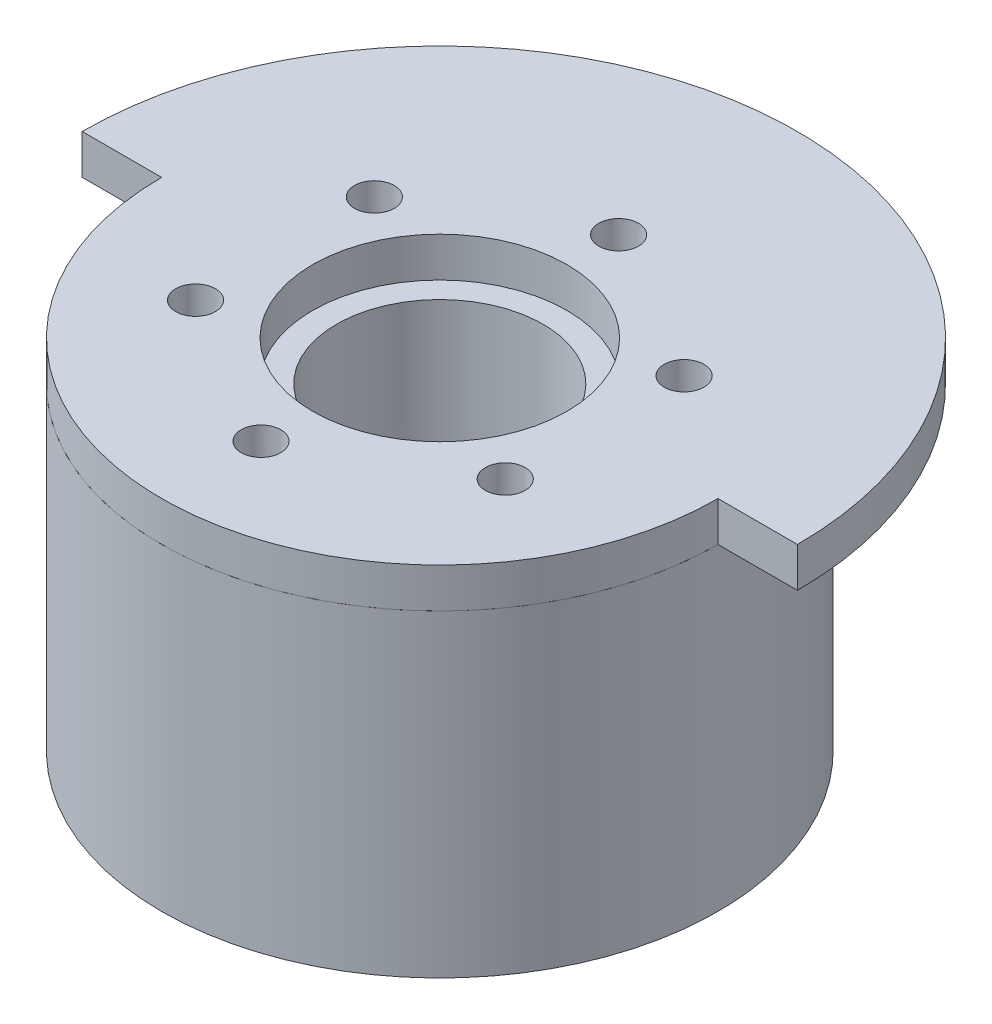
ISO-10303-21;
HEADER;
FILE_DESCRIPTION(('STEP AP214'),'2;1');
FILE_NAME('part.step','',(''),(''),'','','');
FILE_SCHEMA(('AUTOMOTIVE_DESIGN { 1 0 10303 214 1 1 1 1 }'));
ENDSEC;
DATA;
#1=APPLICATION_CONTEXT('core data for automotive mechanical design processes');
#2=APPLICATION_PROTOCOL_DEFINITION('international standard','automotive_design',2000,#1);
#3=PRODUCT_CONTEXT('',#1,'mechanical');
#4=PRODUCT('Part','Part','',(#3));
#5=PRODUCT_RELATED_PRODUCT_CATEGORY('part','',(#4));
#6=PRODUCT_DEFINITION_FORMATION('','',#4);
#7=PRODUCT_DEFINITION_CONTEXT('part definition',#1,'design');
#8=PRODUCT_DEFINITION('design','',#6,#7);
#9=PRODUCT_DEFINITION_SHAPE('','',#8);
#10=(LENGTH_UNIT() NAMED_UNIT(*) SI_UNIT(.MILLI.,.METRE.));
#11=(NAMED_UNIT(*) PLANE_ANGLE_UNIT() SI_UNIT($,.RADIAN.));
#12=(NAMED_UNIT(*) SI_UNIT($,.STERADIAN.) SOLID_ANGLE_UNIT());
#13=UNCERTAINTY_MEASURE_WITH_UNIT(LENGTH_MEASURE(1.E-05),#10,'distance_accuracy_value','');
#14=(GEOMETRIC_REPRESENTATION_CONTEXT(3) GLOBAL_UNCERTAINTY_ASSIGNED_CONTEXT((#13)) GLOBAL_UNIT_ASSIGNED_CONTEXT((#10,
#11,#12)) REPRESENTATION_CONTEXT('',''));
#15=CARTESIAN_POINT('',(0.,0.,0.));
#16=DIRECTION('',(0.,0.,1.));
#17=DIRECTION('',(1.,0.,0.));
#18=AXIS2_PLACEMENT_3D('',#15,#16,#17);
#19=CARTESIAN_POINT('',(0.,45.,0.));
#20=DIRECTION('',(0.,0.,-1.));
#21=DIRECTION('',(-1.,0.,0.));
#22=AXIS2_PLACEMENT_3D('',#19,#20,#21);
#23=PLANE('',#22);
#24=DIRECTION('',(1.,0.,0.));
#25=VECTOR('',#24,1.);
#26=CARTESIAN_POINT('',(0.,40.,0.));
#27=LINE('',#26,#25);
#28=CARTESIAN_POINT('',(35.,40.,0.));
#29=VERTEX_POINT('',#28);
#30=CARTESIAN_POINT('',(45.,40.,0.));
#31=VERTEX_POINT('',#30);
#32=EDGE_CURVE('E129',#29,#31,#27,.T.);
#33=ORIENTED_EDGE('',*,*,#32,.T.);
#34=DIRECTION('',(0.,-1.,0.));
#35=VECTOR('',#34,1.);
#36=CARTESIAN_POINT('',(45.,45.,0.));
#37=LINE('',#36,#35);
#38=CARTESIAN_POINT('',(45.,45.,0.));
#39=VERTEX_POINT('',#38);
#40=EDGE_CURVE('E12',#39,#31,#37,.T.);
#41=ORIENTED_EDGE('',*,*,#40,.F.);
#42=DIRECTION('',(1.,0.,0.));
#43=VECTOR('',#42,1.);
#44=CARTESIAN_POINT('',(0.,45.,0.));
#45=LINE('',#44,#43);
#46=CARTESIAN_POINT('',(35.,45.,0.));
#47=VERTEX_POINT('',#46);
#48=EDGE_CURVE('E99',#47,#39,#45,.T.);
#49=ORIENTED_EDGE('',*,*,#48,.F.);
#50=DIRECTION('',(0.,-1.,0.));
#51=VECTOR('',#50,1.);
#52=CARTESIAN_POINT('',(35.,45.,0.));
#53=LINE('',#52,#51);
#54=EDGE_CURVE('E128',#47,#29,#53,.T.);
#55=ORIENTED_EDGE('',*,*,#54,.T.);
#56=EDGE_LOOP('',(#33,#41,#49,#55));
#57=FACE_BOUND('',#56,.T.);
#58=ADVANCED_FACE('F47',(#57),#23,.F.);
#59=CARTESIAN_POINT('',(0.,45.,0.));
#60=DIRECTION('',(0.,-1.,0.));
#61=DIRECTION('',(0.,0.,-1.));
#62=AXIS2_PLACEMENT_3D('',#59,#60,#61);
#63=CYLINDRICAL_SURFACE('',#62,45.);
#64=CARTESIAN_POINT('',(0.,40.,0.));
#65=DIRECTION('',(0.,1.,0.));
#66=DIRECTION('',(0.,0.,1.));
#67=AXIS2_PLACEMENT_3D('',#64,#65,#66);
#68=CIRCLE('',#67,45.);
#69=CARTESIAN_POINT('',(-45.,40.,0.));
#70=VERTEX_POINT('',#69);
#71=EDGE_CURVE('E103',#31,#70,#68,.T.);
#72=ORIENTED_EDGE('',*,*,#71,.T.);
#73=DIRECTION('',(0.,-1.,0.));
#74=VECTOR('',#73,1.);
#75=CARTESIAN_POINT('',(-45.,45.,0.));
#76=LINE('',#75,#74);
#77=CARTESIAN_POINT('',(-45.,45.,0.));
#78=VERTEX_POINT('',#77);
#79=EDGE_CURVE('E55',#78,#70,#76,.T.);
#80=ORIENTED_EDGE('',*,*,#79,.F.);
#81=CARTESIAN_POINT('',(0.,45.,0.));
#82=DIRECTION('',(0.,1.,0.));
#83=DIRECTION('',(0.,0.,1.));
#84=AXIS2_PLACEMENT_3D('',#81,#82,#83);
#85=CIRCLE('',#84,45.);
#86=EDGE_CURVE('E93',#39,#78,#85,.T.);
#87=ORIENTED_EDGE('',*,*,#86,.F.);
#88=ORIENTED_EDGE('',*,*,#40,.T.);
#89=EDGE_LOOP('',(#72,#80,#87,#88));
#90=FACE_BOUND('',#89,.T.);
#91=ADVANCED_FACE('F102',(#90),#63,.T.);
#92=CARTESIAN_POINT('',(0.,45.,0.));
#93=DIRECTION('',(0.,0.,-1.));
#94=DIRECTION('',(-1.,0.,0.));
#95=AXIS2_PLACEMENT_3D('',#92,#93,#94);
#96=PLANE('',#95);
#97=DIRECTION('',(1.,0.,0.));
#98=VECTOR('',#97,1.);
#99=CARTESIAN_POINT('',(0.,40.,0.));
#100=LINE('',#99,#98);
#101=CARTESIAN_POINT('',(-35.,40.,0.));
#102=VERTEX_POINT('',#101);
#103=EDGE_CURVE('E80',#70,#102,#100,.T.);
#104=ORIENTED_EDGE('',*,*,#103,.T.);
#105=DIRECTION('',(0.,-1.,0.));
#106=VECTOR('',#105,1.);
#107=CARTESIAN_POINT('',(-35.,45.,0.));
#108=LINE('',#107,#106);
#109=CARTESIAN_POINT('',(-35.,45.,0.));
#110=VERTEX_POINT('',#109);
#111=EDGE_CURVE('E104',#110,#102,#108,.T.);
#112=ORIENTED_EDGE('',*,*,#111,.F.);
#113=DIRECTION('',(1.,0.,0.));
#114=VECTOR('',#113,1.);
#115=CARTESIAN_POINT('',(0.,45.,0.));
#116=LINE('',#115,#114);
#117=EDGE_CURVE('E97',#78,#110,#116,.T.);
#118=ORIENTED_EDGE('',*,*,#117,.F.);
#119=ORIENTED_EDGE('',*,*,#79,.T.);
#120=EDGE_LOOP('',(#104,#112,#118,#119));
#121=FACE_BOUND('',#120,.T.);
#122=ADVANCED_FACE('F105',(#121),#96,.F.);
#123=CARTESIAN_POINT('',(19.4855715851499,45.,11.25));
#124=DIRECTION('',(0.,-1.,0.));
#125=DIRECTION('',(0.,0.,-1.));
#126=AXIS2_PLACEMENT_3D('',#123,#124,#125);
#127=CYLINDRICAL_SURFACE('',#126,2.5);
#128=CARTESIAN_POINT('',(19.4855715851499,45.,11.25));
#129=DIRECTION('',(0.,1.,0.));
#130=DIRECTION('',(0.,0.,1.));
#131=AXIS2_PLACEMENT_3D('',#128,#129,#130);
#132=CIRCLE('',#131,2.5);
#133=CARTESIAN_POINT('',(19.4855715851499,45.,13.75));
#134=VERTEX_POINT('',#133);
#135=EDGE_CURVE('E125',#134,#134,#132,.F.);
#136=ORIENTED_EDGE('',*,*,#135,.F.);
#137=EDGE_LOOP('',(#136));
#138=FACE_BOUND('',#137,.T.);
#139=CARTESIAN_POINT('',(19.4855715851499,40.,11.25));
#140=DIRECTION('',(0.,1.,0.));
#141=DIRECTION('',(0.,0.,1.));
#142=AXIS2_PLACEMENT_3D('',#139,#140,#141);
#143=CIRCLE('',#142,2.5);
#144=CARTESIAN_POINT('',(19.4855715851499,40.,13.75));
#145=VERTEX_POINT('',#144);
#146=EDGE_CURVE('E151',#145,#145,#143,.F.);
#147=ORIENTED_EDGE('',*,*,#146,.T.);
#148=EDGE_LOOP('',(#147));
#149=FACE_BOUND('',#148,.T.);
#150=ADVANCED_FACE('F191',(#138,#149),#127,.F.);
#151=CARTESIAN_POINT('',(0.,45.,22.5));
#152=DIRECTION('',(0.,-1.,0.));
#153=DIRECTION('',(0.,0.,-1.));
#154=AXIS2_PLACEMENT_3D('',#151,#152,#153);
#155=CYLINDRICAL_SURFACE('',#154,2.5);
#156=CARTESIAN_POINT('',(0.,45.,22.5));
#157=DIRECTION('',(0.,1.,0.));
#158=DIRECTION('',(0.,0.,1.));
#159=AXIS2_PLACEMENT_3D('',#156,#157,#158);
#160=CIRCLE('',#159,2.5);
#161=CARTESIAN_POINT('',(0.,45.,25.));
#162=VERTEX_POINT('',#161);
#163=EDGE_CURVE('E122',#162,#162,#160,.F.);
#164=ORIENTED_EDGE('',*,*,#163,.F.);
#165=EDGE_LOOP('',(#164));
#166=FACE_BOUND('',#165,.T.);
#167=CARTESIAN_POINT('',(0.,40.,22.5));
#168=DIRECTION('',(0.,1.,0.));
#169=DIRECTION('',(0.,0.,1.));
#170=AXIS2_PLACEMENT_3D('',#167,#168,#169);
#171=CIRCLE('',#170,2.5);
#172=CARTESIAN_POINT('',(0.,40.,25.));
#173=VERTEX_POINT('',#172);
#174=EDGE_CURVE('E148',#173,#173,#171,.F.);
#175=ORIENTED_EDGE('',*,*,#174,.T.);
#176=EDGE_LOOP('',(#175));
#177=FACE_BOUND('',#176,.T.);
#178=ADVANCED_FACE('F208',(#166,#177),#155,.F.);
#179=CARTESIAN_POINT('',(-19.4855715851499,45.,-11.25));
#180=DIRECTION('',(0.,-1.,0.));
#181=DIRECTION('',(0.,0.,-1.));
#182=AXIS2_PLACEMENT_3D('',#179,#180,#181);
#183=CYLINDRICAL_SURFACE('',#182,2.5);
#184=CARTESIAN_POINT('',(-19.4855715851499,45.,-11.25));
#185=DIRECTION('',(0.,1.,0.));
#186=DIRECTION('',(0.,0.,1.));
#187=AXIS2_PLACEMENT_3D('',#184,#185,#186);
#188=CIRCLE('',#187,2.5);
#189=CARTESIAN_POINT('',(-19.4855715851499,45.,-8.74999999999999));
#190=VERTEX_POINT('',#189);
#191=EDGE_CURVE('E119',#190,#190,#188,.F.);
#192=ORIENTED_EDGE('',*,*,#191,.F.);
#193=EDGE_LOOP('',(#192));
#194=FACE_BOUND('',#193,.T.);
#195=CARTESIAN_POINT('',(-19.4855715851499,40.,-11.25));
#196=DIRECTION('',(0.,1.,0.));
#197=DIRECTION('',(0.,0.,1.));
#198=AXIS2_PLACEMENT_3D('',#195,#196,#197);
#199=CIRCLE('',#198,2.5);
#200=CARTESIAN_POINT('',(-19.4855715851499,40.,-8.74999999999999));
#201=VERTEX_POINT('',#200);
#202=EDGE_CURVE('E145',#201,#201,#199,.F.);
#203=ORIENTED_EDGE('',*,*,#202,.T.);
#204=EDGE_LOOP('',(#203));
#205=FACE_BOUND('',#204,.T.);
#206=ADVANCED_FACE('F204',(#194,#205),#183,.F.);
#207=CARTESIAN_POINT('',(19.4855715851499,45.,-11.25));
#208=DIRECTION('',(0.,-1.,0.));
#209=DIRECTION('',(0.,0.,-1.));
#210=AXIS2_PLACEMENT_3D('',#207,#208,#209);
#211=CYLINDRICAL_SURFACE('',#210,2.5);
#212=CARTESIAN_POINT('',(19.4855715851499,45.,-11.25));
#213=DIRECTION('',(0.,1.,0.));
#214=DIRECTION('',(0.,0.,1.));
#215=AXIS2_PLACEMENT_3D('',#212,#213,#214);
#216=CIRCLE('',#215,2.5);
#217=CARTESIAN_POINT('',(19.4855715851499,45.,-8.75000000000001));
#218=VERTEX_POINT('',#217);
#219=EDGE_CURVE('E116',#218,#218,#216,.F.);
#220=ORIENTED_EDGE('',*,*,#219,.F.);
#221=EDGE_LOOP('',(#220));
#222=FACE_BOUND('',#221,.T.);
#223=CARTESIAN_POINT('',(19.4855715851499,40.,-11.25));
#224=DIRECTION('',(0.,1.,0.));
#225=DIRECTION('',(0.,0.,1.));
#226=AXIS2_PLACEMENT_3D('',#223,#224,#225);
#227=CIRCLE('',#226,2.5);
#228=CARTESIAN_POINT('',(19.4855715851499,40.,-8.75000000000001));
#229=VERTEX_POINT('',#228);
#230=EDGE_CURVE('E142',#229,#229,#227,.F.);
#231=ORIENTED_EDGE('',*,*,#230,.T.);
#232=EDGE_LOOP('',(#231));
#233=FACE_BOUND('',#232,.T.);
#234=ADVANCED_FACE('F200',(#222,#233),#211,.F.);
#235=CARTESIAN_POINT('',(0.,45.,-22.5));
#236=DIRECTION('',(0.,-1.,0.));
#237=DIRECTION('',(0.,0.,-1.));
#238=AXIS2_PLACEMENT_3D('',#235,#236,#237);
#239=CYLINDRICAL_SURFACE('',#238,2.5);
#240=CARTESIAN_POINT('',(0.,45.,-22.5));
#241=DIRECTION('',(0.,1.,0.));
#242=DIRECTION('',(0.,0.,1.));
#243=AXIS2_PLACEMENT_3D('',#240,#241,#242);
#244=CIRCLE('',#243,2.5);
#245=CARTESIAN_POINT('',(0.,45.,-20.));
#246=VERTEX_POINT('',#245);
#247=EDGE_CURVE('E113',#246,#246,#244,.F.);
#248=ORIENTED_EDGE('',*,*,#247,.F.);
#249=EDGE_LOOP('',(#248));
#250=FACE_BOUND('',#249,.T.);
#251=CARTESIAN_POINT('',(0.,40.,-22.5));
#252=DIRECTION('',(0.,1.,0.));
#253=DIRECTION('',(0.,0.,1.));
#254=AXIS2_PLACEMENT_3D('',#251,#252,#253);
#255=CIRCLE('',#254,2.5);
#256=CARTESIAN_POINT('',(0.,40.,-20.));
#257=VERTEX_POINT('',#256);
#258=EDGE_CURVE('E139',#257,#257,#255,.F.);
#259=ORIENTED_EDGE('',*,*,#258,.T.);
#260=EDGE_LOOP('',(#259));
#261=FACE_BOUND('',#260,.T.);
#262=ADVANCED_FACE('F196',(#250,#261),#239,.F.);
#263=CARTESIAN_POINT('',(-19.4855715851499,45.,11.25));
#264=DIRECTION('',(0.,-1.,0.));
#265=DIRECTION('',(0.,0.,-1.));
#266=AXIS2_PLACEMENT_3D('',#263,#264,#265);
#267=CYLINDRICAL_SURFACE('',#266,2.5);
#268=CARTESIAN_POINT('',(-19.4855715851499,45.,11.25));
#269=DIRECTION('',(0.,1.,0.));
#270=DIRECTION('',(0.,0.,1.));
#271=AXIS2_PLACEMENT_3D('',#268,#269,#270);
#272=CIRCLE('',#271,2.5);
#273=CARTESIAN_POINT('',(-19.4855715851499,45.,13.75));
#274=VERTEX_POINT('',#273);
#275=EDGE_CURVE('E107',#274,#274,#272,.F.);
#276=ORIENTED_EDGE('',*,*,#275,.F.);
#277=EDGE_LOOP('',(#276));
#278=FACE_BOUND('',#277,.T.);
#279=CARTESIAN_POINT('',(-19.4855715851499,40.,11.25));
#280=DIRECTION('',(0.,1.,0.));
#281=DIRECTION('',(0.,0.,1.));
#282=AXIS2_PLACEMENT_3D('',#279,#280,#281);
#283=CIRCLE('',#282,2.5);
#284=CARTESIAN_POINT('',(-19.4855715851499,40.,13.75));
#285=VERTEX_POINT('',#284);
#286=EDGE_CURVE('E136',#285,#285,#283,.F.);
#287=ORIENTED_EDGE('',*,*,#286,.T.);
#288=EDGE_LOOP('',(#287));
#289=FACE_BOUND('',#288,.T.);
#290=ADVANCED_FACE('F182',(#278,#289),#267,.F.);
#291=CARTESIAN_POINT('',(0.,45.,0.));
#292=DIRECTION('',(0.,-1.,0.));
#293=DIRECTION('',(0.,0.,-1.));
#294=AXIS2_PLACEMENT_3D('',#291,#292,#293);
#295=CYLINDRICAL_SURFACE('',#294,35.);
#296=CARTESIAN_POINT('',(0.,40.,0.));
#297=DIRECTION('',(0.,1.,0.));
#298=DIRECTION('',(0.,0.,1.));
#299=AXIS2_PLACEMENT_3D('',#296,#297,#298);
#300=CIRCLE('',#299,35.);
#301=EDGE_CURVE('E86',#102,#29,#300,.T.);
#302=ORIENTED_EDGE('',*,*,#301,.T.);
#303=ORIENTED_EDGE('',*,*,#54,.F.);
#304=CARTESIAN_POINT('',(0.,45.,0.));
#305=DIRECTION('',(0.,1.,0.));
#306=DIRECTION('',(0.,0.,1.));
#307=AXIS2_PLACEMENT_3D('',#304,#305,#306);
#308=CIRCLE('',#307,35.);
#309=EDGE_CURVE('E63',#110,#47,#308,.T.);
#310=ORIENTED_EDGE('',*,*,#309,.F.);
#311=ORIENTED_EDGE('',*,*,#111,.T.);
#312=EDGE_LOOP('',(#302,#303,#310,#311));
#313=FACE_BOUND('',#312,.T.);
#314=ADVANCED_FACE('F155',(#313),#295,.T.);
#315=CARTESIAN_POINT('',(0.,45.,0.));
#316=DIRECTION('',(0.,1.,0.));
#317=DIRECTION('',(0.,0.,1.));
#318=AXIS2_PLACEMENT_3D('',#315,#316,#317);
#319=PLANE('',#318);
#320=CARTESIAN_POINT('',(0.,45.,0.));
#321=DIRECTION('',(0.,1.,0.));
#322=DIRECTION('',(0.,0.,1.));
#323=AXIS2_PLACEMENT_3D('',#320,#321,#322);
#324=CIRCLE('',#323,16.);
#325=CARTESIAN_POINT('',(0.,45.,16.));
#326=VERTEX_POINT('',#325);
#327=EDGE_CURVE('E162',#326,#326,#324,.T.);
#328=ORIENTED_EDGE('',*,*,#327,.F.);
#329=EDGE_LOOP('',(#328));
#330=FACE_BOUND('',#329,.T.);
#331=ORIENTED_EDGE('',*,*,#48,.T.);
#332=ORIENTED_EDGE('',*,*,#86,.T.);
#333=ORIENTED_EDGE('',*,*,#117,.T.);
#334=ORIENTED_EDGE('',*,*,#309,.T.);
#335=EDGE_LOOP('',(#331,#332,#333,#334));
#336=FACE_BOUND('',#335,.T.);
#337=ORIENTED_EDGE('',*,*,#275,.T.);
#338=EDGE_LOOP('',(#337));
#339=FACE_BOUND('',#338,.T.);
#340=ORIENTED_EDGE('',*,*,#247,.T.);
#341=EDGE_LOOP('',(#340));
#342=FACE_BOUND('',#341,.T.);
#343=ORIENTED_EDGE('',*,*,#219,.T.);
#344=EDGE_LOOP('',(#343));
#345=FACE_BOUND('',#344,.T.);
#346=ORIENTED_EDGE('',*,*,#191,.T.);
#347=EDGE_LOOP('',(#346));
#348=FACE_BOUND('',#347,.T.);
#349=ORIENTED_EDGE('',*,*,#163,.T.);
#350=EDGE_LOOP('',(#349));
#351=FACE_BOUND('',#350,.T.);
#352=ORIENTED_EDGE('',*,*,#135,.T.);
#353=EDGE_LOOP('',(#352));
#354=FACE_BOUND('',#353,.T.);
#355=ADVANCED_FACE('F94',(#330,#336,#339,#342,#345,#348,#351,#354),#319,.T.);
#356=CARTESIAN_POINT('',(0.,40.,0.));
#357=DIRECTION('',(0.,1.,0.));
#358=DIRECTION('',(0.,0.,1.));
#359=AXIS2_PLACEMENT_3D('',#356,#357,#358);
#360=PLANE('',#359);
#361=CARTESIAN_POINT('',(0.,40.,0.));
#362=DIRECTION('',(0.,1.,0.));
#363=DIRECTION('',(0.,0.,1.));
#364=AXIS2_PLACEMENT_3D('',#361,#362,#363);
#365=CIRCLE('',#364,16.);
#366=CARTESIAN_POINT('',(0.,40.,16.));
#367=VERTEX_POINT('',#366);
#368=EDGE_CURVE('E132',#367,#367,#365,.T.);
#369=ORIENTED_EDGE('',*,*,#368,.T.);
#370=EDGE_LOOP('',(#369));
#371=FACE_BOUND('',#370,.T.);
#372=ORIENTED_EDGE('',*,*,#32,.F.);
#373=ORIENTED_EDGE('',*,*,#301,.F.);
#374=ORIENTED_EDGE('',*,*,#103,.F.);
#375=ORIENTED_EDGE('',*,*,#71,.F.);
#376=EDGE_LOOP('',(#372,#373,#374,#375));
#377=FACE_BOUND('',#376,.T.);
#378=ORIENTED_EDGE('',*,*,#286,.F.);
#379=EDGE_LOOP('',(#378));
#380=FACE_BOUND('',#379,.T.);
#381=ORIENTED_EDGE('',*,*,#258,.F.);
#382=EDGE_LOOP('',(#381));
#383=FACE_BOUND('',#382,.T.);
#384=ORIENTED_EDGE('',*,*,#230,.F.);
#385=EDGE_LOOP('',(#384));
#386=FACE_BOUND('',#385,.T.);
#387=ORIENTED_EDGE('',*,*,#202,.F.);
#388=EDGE_LOOP('',(#387));
#389=FACE_BOUND('',#388,.T.);
#390=ORIENTED_EDGE('',*,*,#174,.F.);
#391=EDGE_LOOP('',(#390));
#392=FACE_BOUND('',#391,.T.);
#393=ORIENTED_EDGE('',*,*,#146,.F.);
#394=EDGE_LOOP('',(#393));
#395=FACE_BOUND('',#394,.T.);
#396=ADVANCED_FACE('F158',(#371,#377,#380,#383,#386,#389,#392,#395),#360,.F.);
#397=CARTESIAN_POINT('',(0.,40.,0.));
#398=DIRECTION('',(0.,1.,0.));
#399=DIRECTION('',(0.,0.,1.));
#400=AXIS2_PLACEMENT_3D('',#397,#398,#399);
#401=CYLINDRICAL_SURFACE('',#400,16.);
#402=ORIENTED_EDGE('',*,*,#368,.F.);
#403=EDGE_LOOP('',(#402));
#404=FACE_BOUND('',#403,.T.);
#405=ORIENTED_EDGE('',*,*,#327,.T.);
#406=EDGE_LOOP('',(#405));
#407=FACE_BOUND('',#406,.T.);
#408=ADVANCED_FACE('F169',(#404,#407),#401,.F.);
#409=CLOSED_SHELL('',(#58,#91,#122,#150,#178,#206,#234,#262,#290,#314,#355,#396,#408));
#410=MANIFOLD_SOLID_BREP('B2',#409);
#411=CARTESIAN_POINT('',(0.,40.,0.));
#412=DIRECTION('',(0.,1.,0.));
#413=DIRECTION('',(0.,0.,1.));
#414=AXIS2_PLACEMENT_3D('',#411,#412,#413);
#415=PLANE('',#414);
#416=CARTESIAN_POINT('',(-19.4855715851499,40.,11.25));
#417=DIRECTION('',(0.,1.,0.));
#418=DIRECTION('',(0.,0.,1.));
#419=AXIS2_PLACEMENT_3D('',#416,#417,#418);
#420=CIRCLE('',#419,2.5);
#421=CARTESIAN_POINT('',(-19.4855715851499,40.,13.75));
#422=VERTEX_POINT('',#421);
#423=EDGE_CURVE('E376',#422,#422,#420,.T.);
#424=ORIENTED_EDGE('',*,*,#423,.F.);
#425=EDGE_LOOP('',(#424));
#426=FACE_BOUND('',#425,.T.);
#427=CARTESIAN_POINT('',(19.4855715851499,40.,11.25));
#428=DIRECTION('',(0.,1.,0.));
#429=DIRECTION('',(0.,0.,1.));
#430=AXIS2_PLACEMENT_3D('',#427,#428,#429);
#431=CIRCLE('',#430,2.5);
#432=CARTESIAN_POINT('',(19.4855715851499,40.,13.75));
#433=VERTEX_POINT('',#432);
#434=EDGE_CURVE('E364',#433,#433,#431,.T.);
#435=ORIENTED_EDGE('',*,*,#434,.F.);
#436=EDGE_LOOP('',(#435));
#437=FACE_BOUND('',#436,.T.);
#438=CARTESIAN_POINT('',(0.,40.,-22.5));
#439=DIRECTION('',(0.,1.,0.));
#440=DIRECTION('',(0.,0.,1.));
#441=AXIS2_PLACEMENT_3D('',#438,#439,#440);
#442=CIRCLE('',#441,2.5);
#443=CARTESIAN_POINT('',(0.,40.,-20.));
#444=VERTEX_POINT('',#443);
#445=EDGE_CURVE('E353',#444,#444,#442,.T.);
#446=ORIENTED_EDGE('',*,*,#445,.F.);
#447=EDGE_LOOP('',(#446));
#448=FACE_BOUND('',#447,.T.);
#449=CARTESIAN_POINT('',(0.,40.,0.));
#450=DIRECTION('',(0.,1.,0.));
#451=DIRECTION('',(0.,0.,1.));
#452=AXIS2_PLACEMENT_3D('',#449,#450,#451);
#453=CIRCLE('',#452,35.);
#454=CARTESIAN_POINT('',(0.,40.,35.));
#455=VERTEX_POINT('',#454);
#456=EDGE_CURVE('E46',#455,#455,#453,.T.);
#457=ORIENTED_EDGE('',*,*,#456,.T.);
#458=EDGE_LOOP('',(#457));
#459=FACE_BOUND('',#458,.T.);
#460=CARTESIAN_POINT('',(19.4855715851499,40.,-11.25));
#461=DIRECTION('',(0.,1.,0.));
#462=DIRECTION('',(0.,0.,1.));
#463=AXIS2_PLACEMENT_3D('',#460,#461,#462);
#464=CIRCLE('',#463,2.5);
#465=CARTESIAN_POINT('',(19.4855715851499,40.,-8.75000000000001));
#466=VERTEX_POINT('',#465);
#467=EDGE_CURVE('E358',#466,#466,#464,.T.);
#468=ORIENTED_EDGE('',*,*,#467,.F.);
#469=EDGE_LOOP('',(#468));
#470=FACE_BOUND('',#469,.T.);
#471=CARTESIAN_POINT('',(0.,40.,22.5));
#472=DIRECTION('',(0.,1.,0.));
#473=DIRECTION('',(0.,0.,1.));
#474=AXIS2_PLACEMENT_3D('',#471,#472,#473);
#475=CIRCLE('',#474,2.5);
#476=CARTESIAN_POINT('',(0.,40.,25.));
#477=VERTEX_POINT('',#476);
#478=EDGE_CURVE('E370',#477,#477,#475,.T.);
#479=ORIENTED_EDGE('',*,*,#478,.F.);
#480=EDGE_LOOP('',(#479));
#481=FACE_BOUND('',#480,.T.);
#482=CARTESIAN_POINT('',(-19.4855715851499,40.,-11.25));
#483=DIRECTION('',(0.,1.,0.));
#484=DIRECTION('',(0.,0.,1.));
#485=AXIS2_PLACEMENT_3D('',#482,#483,#484);
#486=CIRCLE('',#485,2.5);
#487=CARTESIAN_POINT('',(-19.4855715851499,40.,-8.74999999999999));
#488=VERTEX_POINT('',#487);
#489=EDGE_CURVE('E382',#488,#488,#486,.T.);
#490=ORIENTED_EDGE('',*,*,#489,.F.);
#491=EDGE_LOOP('',(#490));
#492=FACE_BOUND('',#491,.T.);
#493=CARTESIAN_POINT('',(0.,40.,0.));
#494=DIRECTION('',(0.,1.,0.));
#495=DIRECTION('',(0.,0.,1.));
#496=AXIS2_PLACEMENT_3D('',#493,#494,#495);
#497=CIRCLE('',#496,13.);
#498=CARTESIAN_POINT('',(0.,40.,13.));
#499=VERTEX_POINT('',#498);
#500=EDGE_CURVE('E399',#499,#499,#497,.T.);
#501=ORIENTED_EDGE('',*,*,#500,.F.);
#502=EDGE_LOOP('',(#501));
#503=FACE_BOUND('',#502,.T.);
#504=ADVANCED_FACE('F342',(#426,#437,#448,#459,#470,#481,#492,#503),#415,.T.);
#505=CARTESIAN_POINT('',(0.,0.,0.));
#506=DIRECTION('',(0.,1.,0.));
#507=DIRECTION('',(0.,0.,1.));
#508=AXIS2_PLACEMENT_3D('',#505,#506,#507);
#509=PLANE('',#508);
#510=CARTESIAN_POINT('',(0.,0.,0.));
#511=DIRECTION('',(0.,-1.,0.));
#512=DIRECTION('',(0.,0.,-1.));
#513=AXIS2_PLACEMENT_3D('',#510,#511,#512);
#514=CIRCLE('',#513,16.);
#515=CARTESIAN_POINT('',(0.,0.,-16.));
#516=VERTEX_POINT('',#515);
#517=EDGE_CURVE('E391',#516,#516,#514,.T.);
#518=ORIENTED_EDGE('',*,*,#517,.F.);
#519=EDGE_LOOP('',(#518));
#520=FACE_BOUND('',#519,.T.);
#521=CARTESIAN_POINT('',(0.,0.,0.));
#522=DIRECTION('',(0.,1.,0.));
#523=DIRECTION('',(0.,0.,1.));
#524=AXIS2_PLACEMENT_3D('',#521,#522,#523);
#525=CIRCLE('',#524,35.);
#526=CARTESIAN_POINT('',(0.,0.,35.));
#527=VERTEX_POINT('',#526);
#528=EDGE_CURVE('E346',#527,#527,#525,.T.);
#529=ORIENTED_EDGE('',*,*,#528,.F.);
#530=EDGE_LOOP('',(#529));
#531=FACE_BOUND('',#530,.T.);
#532=CARTESIAN_POINT('',(0.,0.,-22.5));
#533=DIRECTION('',(0.,1.,0.));
#534=DIRECTION('',(0.,0.,1.));
#535=AXIS2_PLACEMENT_3D('',#532,#533,#534);
#536=CIRCLE('',#535,2.5);
#537=CARTESIAN_POINT('',(0.,0.,-20.));
#538=VERTEX_POINT('',#537);
#539=EDGE_CURVE('E355',#538,#538,#536,.T.);
#540=ORIENTED_EDGE('',*,*,#539,.T.);
#541=EDGE_LOOP('',(#540));
#542=FACE_BOUND('',#541,.T.);
#543=CARTESIAN_POINT('',(19.4855715851499,0.,-11.25));
#544=DIRECTION('',(0.,1.,0.));
#545=DIRECTION('',(0.,0.,1.));
#546=AXIS2_PLACEMENT_3D('',#543,#544,#545);
#547=CIRCLE('',#546,2.5);
#548=CARTESIAN_POINT('',(19.4855715851499,0.,-8.75000000000001));
#549=VERTEX_POINT('',#548);
#550=EDGE_CURVE('E361',#549,#549,#547,.T.);
#551=ORIENTED_EDGE('',*,*,#550,.T.);
#552=EDGE_LOOP('',(#551));
#553=FACE_BOUND('',#552,.T.);
#554=CARTESIAN_POINT('',(19.4855715851499,0.,11.25));
#555=DIRECTION('',(0.,1.,0.));
#556=DIRECTION('',(0.,0.,1.));
#557=AXIS2_PLACEMENT_3D('',#554,#555,#556);
#558=CIRCLE('',#557,2.5);
#559=CARTESIAN_POINT('',(19.4855715851499,0.,13.75));
#560=VERTEX_POINT('',#559);
#561=EDGE_CURVE('E367',#560,#560,#558,.T.);
#562=ORIENTED_EDGE('',*,*,#561,.T.);
#563=EDGE_LOOP('',(#562));
#564=FACE_BOUND('',#563,.T.);
#565=CARTESIAN_POINT('',(0.,0.,22.5));
#566=DIRECTION('',(0.,1.,0.));
#567=DIRECTION('',(0.,0.,1.));
#568=AXIS2_PLACEMENT_3D('',#565,#566,#567);
#569=CIRCLE('',#568,2.5);
#570=CARTESIAN_POINT('',(0.,0.,25.));
#571=VERTEX_POINT('',#570);
#572=EDGE_CURVE('E373',#571,#571,#569,.T.);
#573=ORIENTED_EDGE('',*,*,#572,.T.);
#574=EDGE_LOOP('',(#573));
#575=FACE_BOUND('',#574,.T.);
#576=CARTESIAN_POINT('',(-19.4855715851499,0.,11.25));
#577=DIRECTION('',(0.,1.,0.));
#578=DIRECTION('',(0.,0.,1.));
#579=AXIS2_PLACEMENT_3D('',#576,#577,#578);
#580=CIRCLE('',#579,2.5);
#581=CARTESIAN_POINT('',(-19.4855715851499,0.,13.75));
#582=VERTEX_POINT('',#581);
#583=EDGE_CURVE('E379',#582,#582,#580,.T.);
#584=ORIENTED_EDGE('',*,*,#583,.T.);
#585=EDGE_LOOP('',(#584));
#586=FACE_BOUND('',#585,.T.);
#587=CARTESIAN_POINT('',(-19.4855715851499,0.,-11.25));
#588=DIRECTION('',(0.,1.,0.));
#589=DIRECTION('',(0.,0.,1.));
#590=AXIS2_PLACEMENT_3D('',#587,#588,#589);
#591=CIRCLE('',#590,2.5);
#592=CARTESIAN_POINT('',(-19.4855715851499,0.,-8.74999999999999));
#593=VERTEX_POINT('',#592);
#594=EDGE_CURVE('E385',#593,#593,#591,.T.);
#595=ORIENTED_EDGE('',*,*,#594,.T.);
#596=EDGE_LOOP('',(#595));
#597=FACE_BOUND('',#596,.T.);
#598=ADVANCED_FACE('F407',(#520,#531,#542,#553,#564,#575,#586,#597),#509,.F.);
#599=CARTESIAN_POINT('',(0.,40.,0.));
#600=DIRECTION('',(0.,-1.,0.));
#601=DIRECTION('',(0.,0.,-1.));
#602=AXIS2_PLACEMENT_3D('',#599,#600,#601);
#603=CYLINDRICAL_SURFACE('',#602,35.);
#604=ORIENTED_EDGE('',*,*,#456,.F.);
#605=EDGE_LOOP('',(#604));
#606=FACE_BOUND('',#605,.T.);
#607=ORIENTED_EDGE('',*,*,#528,.T.);
#608=EDGE_LOOP('',(#607));
#609=FACE_BOUND('',#608,.T.);
#610=ADVANCED_FACE('F344',(#606,#609),#603,.T.);
#611=CARTESIAN_POINT('',(0.,40.,-22.5));
#612=DIRECTION('',(0.,-1.,0.));
#613=DIRECTION('',(0.,0.,-1.));
#614=AXIS2_PLACEMENT_3D('',#611,#612,#613);
#615=CYLINDRICAL_SURFACE('',#614,2.5);
#616=ORIENTED_EDGE('',*,*,#445,.T.);
#617=EDGE_LOOP('',(#616));
#618=FACE_BOUND('',#617,.T.);
#619=ORIENTED_EDGE('',*,*,#539,.F.);
#620=EDGE_LOOP('',(#619));
#621=FACE_BOUND('',#620,.T.);
#622=ADVANCED_FACE('F417',(#618,#621),#615,.F.);
#623=CARTESIAN_POINT('',(19.4855715851499,40.,-11.25));
#624=DIRECTION('',(0.,-1.,0.));
#625=DIRECTION('',(0.,0.,-1.));
#626=AXIS2_PLACEMENT_3D('',#623,#624,#625);
#627=CYLINDRICAL_SURFACE('',#626,2.5);
#628=ORIENTED_EDGE('',*,*,#467,.T.);
#629=EDGE_LOOP('',(#628));
#630=FACE_BOUND('',#629,.T.);
#631=ORIENTED_EDGE('',*,*,#550,.F.);
#632=EDGE_LOOP('',(#631));
#633=FACE_BOUND('',#632,.T.);
#634=ADVANCED_FACE('F420',(#630,#633),#627,.F.);
#635=CARTESIAN_POINT('',(19.4855715851499,40.,11.25));
#636=DIRECTION('',(0.,-1.,0.));
#637=DIRECTION('',(0.,0.,-1.));
#638=AXIS2_PLACEMENT_3D('',#635,#636,#637);
#639=CYLINDRICAL_SURFACE('',#638,2.5);
#640=ORIENTED_EDGE('',*,*,#434,.T.);
#641=EDGE_LOOP('',(#640));
#642=FACE_BOUND('',#641,.T.);
#643=ORIENTED_EDGE('',*,*,#561,.F.);
#644=EDGE_LOOP('',(#643));
#645=FACE_BOUND('',#644,.T.);
#646=ADVANCED_FACE('F424',(#642,#645),#639,.F.);
#647=CARTESIAN_POINT('',(0.,40.,22.5));
#648=DIRECTION('',(0.,-1.,0.));
#649=DIRECTION('',(0.,0.,-1.));
#650=AXIS2_PLACEMENT_3D('',#647,#648,#649);
#651=CYLINDRICAL_SURFACE('',#650,2.5);
#652=ORIENTED_EDGE('',*,*,#478,.T.);
#653=EDGE_LOOP('',(#652));
#654=FACE_BOUND('',#653,.T.);
#655=ORIENTED_EDGE('',*,*,#572,.F.);
#656=EDGE_LOOP('',(#655));
#657=FACE_BOUND('',#656,.T.);
#658=ADVANCED_FACE('F428',(#654,#657),#651,.F.);
#659=CARTESIAN_POINT('',(-19.4855715851499,40.,11.25));
#660=DIRECTION('',(0.,-1.,0.));
#661=DIRECTION('',(0.,0.,-1.));
#662=AXIS2_PLACEMENT_3D('',#659,#660,#661);
#663=CYLINDRICAL_SURFACE('',#662,2.5);
#664=ORIENTED_EDGE('',*,*,#423,.T.);
#665=EDGE_LOOP('',(#664));
#666=FACE_BOUND('',#665,.T.);
#667=ORIENTED_EDGE('',*,*,#583,.F.);
#668=EDGE_LOOP('',(#667));
#669=FACE_BOUND('',#668,.T.);
#670=ADVANCED_FACE('F432',(#666,#669),#663,.F.);
#671=CARTESIAN_POINT('',(-19.4855715851499,40.,-11.25));
#672=DIRECTION('',(0.,-1.,0.));
#673=DIRECTION('',(0.,0.,-1.));
#674=AXIS2_PLACEMENT_3D('',#671,#672,#673);
#675=CYLINDRICAL_SURFACE('',#674,2.5);
#676=ORIENTED_EDGE('',*,*,#489,.T.);
#677=EDGE_LOOP('',(#676));
#678=FACE_BOUND('',#677,.T.);
#679=ORIENTED_EDGE('',*,*,#594,.F.);
#680=EDGE_LOOP('',(#679));
#681=FACE_BOUND('',#680,.T.);
#682=ADVANCED_FACE('F436',(#678,#681),#675,.F.);
#683=CARTESIAN_POINT('',(0.,5.,0.));
#684=DIRECTION('',(0.,-1.,0.));
#685=DIRECTION('',(0.,0.,-1.));
#686=AXIS2_PLACEMENT_3D('',#683,#684,#685);
#687=CYLINDRICAL_SURFACE('',#686,16.);
#688=CARTESIAN_POINT('',(0.,5.,0.));
#689=DIRECTION('',(0.,-1.,0.));
#690=DIRECTION('',(0.,0.,-1.));
#691=AXIS2_PLACEMENT_3D('',#688,#689,#690);
#692=CIRCLE('',#691,16.);
#693=CARTESIAN_POINT('',(0.,5.,-16.));
#694=VERTEX_POINT('',#693);
#695=EDGE_CURVE('E388',#694,#694,#692,.T.);
#696=ORIENTED_EDGE('',*,*,#695,.F.);
#697=EDGE_LOOP('',(#696));
#698=FACE_BOUND('',#697,.T.);
#699=ORIENTED_EDGE('',*,*,#517,.T.);
#700=EDGE_LOOP('',(#699));
#701=FACE_BOUND('',#700,.T.);
#702=ADVANCED_FACE('F440',(#698,#701),#687,.F.);
#703=CARTESIAN_POINT('',(0.,5.,0.));
#704=DIRECTION('',(0.,-1.,0.));
#705=DIRECTION('',(0.,0.,-1.));
#706=AXIS2_PLACEMENT_3D('',#703,#704,#705);
#707=PLANE('',#706);
#708=CARTESIAN_POINT('',(0.,5.,0.));
#709=DIRECTION('',(0.,-1.,0.));
#710=DIRECTION('',(0.,0.,-1.));
#711=AXIS2_PLACEMENT_3D('',#708,#709,#710);
#712=CIRCLE('',#711,13.);
#713=CARTESIAN_POINT('',(0.,5.,-13.));
#714=VERTEX_POINT('',#713);
#715=EDGE_CURVE('E394',#714,#714,#712,.F.);
#716=ORIENTED_EDGE('',*,*,#715,.T.);
#717=EDGE_LOOP('',(#716));
#718=FACE_BOUND('',#717,.T.);
#719=ORIENTED_EDGE('',*,*,#695,.T.);
#720=EDGE_LOOP('',(#719));
#721=FACE_BOUND('',#720,.T.);
#722=ADVANCED_FACE('F444',(#718,#721),#707,.T.);
#723=CARTESIAN_POINT('',(0.,-31.7695526217005,0.));
#724=DIRECTION('',(0.,1.,0.));
#725=DIRECTION('',(0.,0.,1.));
#726=AXIS2_PLACEMENT_3D('',#723,#724,#725);
#727=CYLINDRICAL_SURFACE('',#726,13.);
#728=ORIENTED_EDGE('',*,*,#500,.T.);
#729=EDGE_LOOP('',(#728));
#730=FACE_BOUND('',#729,.T.);
#731=ORIENTED_EDGE('',*,*,#715,.F.);
#732=EDGE_LOOP('',(#731));
#733=FACE_BOUND('',#732,.T.);
#734=ADVANCED_FACE('F403',(#730,#733),#727,.F.);
#735=CLOSED_SHELL('',(#504,#598,#610,#622,#634,#646,#658,#670,#682,#702,#722,#734));
#736=MANIFOLD_SOLID_BREP('B6',#735);
#737=ADVANCED_BREP_SHAPE_REPRESENTATION('',(#18,#410,#736),#14);
#738=SHAPE_DEFINITION_REPRESENTATION(#9,#737);
ENDSEC;
END-ISO-10303-21;
